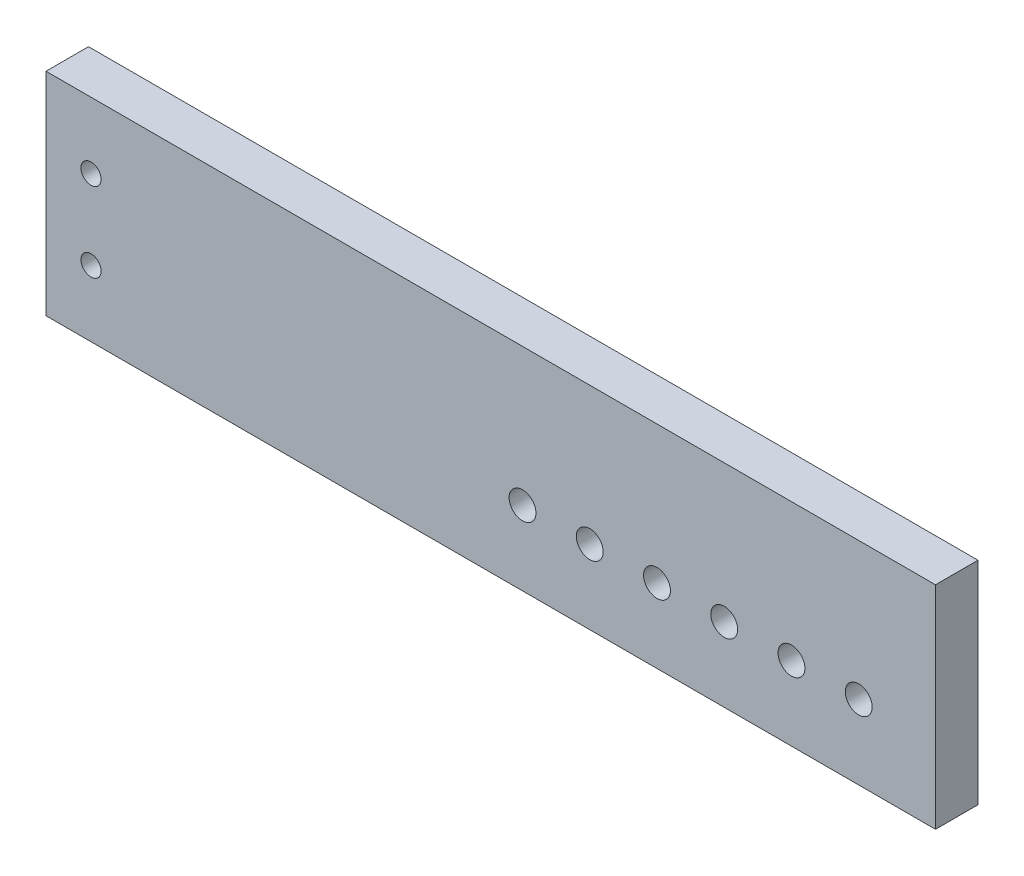
ISO-10303-21;
HEADER;
FILE_DESCRIPTION(('STEP AP214'),'2;1');
FILE_NAME('part.step','',(''),(''),'','','');
FILE_SCHEMA(('AUTOMOTIVE_DESIGN { 1 0 10303 214 1 1 1 1 }'));
ENDSEC;
DATA;
#1=APPLICATION_CONTEXT('core data for automotive mechanical design processes');
#2=APPLICATION_PROTOCOL_DEFINITION('international standard','automotive_design',2000,#1);
#3=PRODUCT_CONTEXT('',#1,'mechanical');
#4=PRODUCT('Part','Part','',(#3));
#5=PRODUCT_RELATED_PRODUCT_CATEGORY('part','',(#4));
#6=PRODUCT_DEFINITION_FORMATION('','',#4);
#7=PRODUCT_DEFINITION_CONTEXT('part definition',#1,'design');
#8=PRODUCT_DEFINITION('design','',#6,#7);
#9=PRODUCT_DEFINITION_SHAPE('','',#8);
#10=(LENGTH_UNIT() NAMED_UNIT(*) SI_UNIT(.MILLI.,.METRE.));
#11=(NAMED_UNIT(*) PLANE_ANGLE_UNIT() SI_UNIT($,.RADIAN.));
#12=(NAMED_UNIT(*) SI_UNIT($,.STERADIAN.) SOLID_ANGLE_UNIT());
#13=UNCERTAINTY_MEASURE_WITH_UNIT(LENGTH_MEASURE(1.E-05),#10,'distance_accuracy_value','');
#14=(GEOMETRIC_REPRESENTATION_CONTEXT(3) GLOBAL_UNCERTAINTY_ASSIGNED_CONTEXT((#13)) GLOBAL_UNIT_ASSIGNED_CONTEXT((#10,
#11,#12)) REPRESENTATION_CONTEXT('',''));
#15=CARTESIAN_POINT('',(0.,0.,0.));
#16=DIRECTION('',(0.,0.,1.));
#17=DIRECTION('',(1.,0.,0.));
#18=AXIS2_PLACEMENT_3D('',#15,#16,#17);
#19=CARTESIAN_POINT('',(37.5,5.4,0.803));
#20=DIRECTION('',(0.,0.,-1.));
#21=DIRECTION('',(-1.,0.,0.));
#22=AXIS2_PLACEMENT_3D('',#19,#20,#21);
#23=PLANE('',#22);
#24=CARTESIAN_POINT('',(34.6,0.2,0.803));
#25=DIRECTION('',(0.,0.,-1.));
#26=DIRECTION('',(-1.,0.,0.));
#27=AXIS2_PLACEMENT_3D('',#24,#25,#26);
#28=CIRCLE('',#27,0.508);
#29=CARTESIAN_POINT('',(34.092,0.2,0.803));
#30=VERTEX_POINT('',#29);
#31=EDGE_CURVE('E103',#30,#30,#28,.T.);
#32=ORIENTED_EDGE('',*,*,#31,.T.);
#33=EDGE_LOOP('',(#32));
#34=FACE_BOUND('',#33,.T.);
#35=CARTESIAN_POINT('',(29.52,0.2,0.803));
#36=DIRECTION('',(0.,0.,-1.));
#37=DIRECTION('',(-1.,0.,0.));
#38=AXIS2_PLACEMENT_3D('',#35,#36,#37);
#39=CIRCLE('',#38,0.508);
#40=CARTESIAN_POINT('',(29.012,0.2,0.803));
#41=VERTEX_POINT('',#40);
#42=EDGE_CURVE('E107',#41,#41,#39,.T.);
#43=ORIENTED_EDGE('',*,*,#42,.T.);
#44=EDGE_LOOP('',(#43));
#45=FACE_BOUND('',#44,.T.);
#46=CARTESIAN_POINT('',(32.06,0.2,0.803));
#47=DIRECTION('',(0.,0.,-1.));
#48=DIRECTION('',(-1.,0.,0.));
#49=AXIS2_PLACEMENT_3D('',#46,#47,#48);
#50=CIRCLE('',#49,0.508);
#51=CARTESIAN_POINT('',(31.552,0.2,0.803));
#52=VERTEX_POINT('',#51);
#53=EDGE_CURVE('E110',#52,#52,#50,.T.);
#54=ORIENTED_EDGE('',*,*,#53,.T.);
#55=EDGE_LOOP('',(#54));
#56=FACE_BOUND('',#55,.T.);
#57=CARTESIAN_POINT('',(5.6,-0.1,0.803));
#58=DIRECTION('',(0.,0.,-1.));
#59=DIRECTION('',(-1.,0.,0.));
#60=AXIS2_PLACEMENT_3D('',#57,#58,#59);
#61=CIRCLE('',#60,0.381);
#62=CARTESIAN_POINT('',(5.219,-0.1,0.803));
#63=VERTEX_POINT('',#62);
#64=EDGE_CURVE('E113',#63,#63,#61,.T.);
#65=ORIENTED_EDGE('',*,*,#64,.T.);
#66=EDGE_LOOP('',(#65));
#67=FACE_BOUND('',#66,.T.);
#68=CARTESIAN_POINT('',(5.6,2.9,0.803));
#69=DIRECTION('',(0.,0.,-1.));
#70=DIRECTION('',(-1.,0.,0.));
#71=AXIS2_PLACEMENT_3D('',#68,#69,#70);
#72=CIRCLE('',#71,0.381);
#73=CARTESIAN_POINT('',(5.219,2.9,0.803));
#74=VERTEX_POINT('',#73);
#75=EDGE_CURVE('E116',#74,#74,#72,.T.);
#76=ORIENTED_EDGE('',*,*,#75,.T.);
#77=EDGE_LOOP('',(#76));
#78=FACE_BOUND('',#77,.T.);
#79=CARTESIAN_POINT('',(24.44,0.2,0.803));
#80=DIRECTION('',(0.,0.,-1.));
#81=DIRECTION('',(-1.,0.,0.));
#82=AXIS2_PLACEMENT_3D('',#79,#80,#81);
#83=CIRCLE('',#82,0.508);
#84=CARTESIAN_POINT('',(23.932,0.2,0.803));
#85=VERTEX_POINT('',#84);
#86=EDGE_CURVE('E119',#85,#85,#83,.T.);
#87=ORIENTED_EDGE('',*,*,#86,.T.);
#88=EDGE_LOOP('',(#87));
#89=FACE_BOUND('',#88,.T.);
#90=CARTESIAN_POINT('',(21.9,0.2,0.803));
#91=DIRECTION('',(0.,0.,-1.));
#92=DIRECTION('',(-1.,0.,0.));
#93=AXIS2_PLACEMENT_3D('',#90,#91,#92);
#94=CIRCLE('',#93,0.508);
#95=CARTESIAN_POINT('',(21.392,0.2,0.803));
#96=VERTEX_POINT('',#95);
#97=EDGE_CURVE('E121',#96,#96,#94,.T.);
#98=ORIENTED_EDGE('',*,*,#97,.T.);
#99=EDGE_LOOP('',(#98));
#100=FACE_BOUND('',#99,.T.);
#101=CARTESIAN_POINT('',(26.98,0.2,0.803));
#102=DIRECTION('',(0.,0.,-1.));
#103=DIRECTION('',(-1.,0.,0.));
#104=AXIS2_PLACEMENT_3D('',#101,#102,#103);
#105=CIRCLE('',#104,0.508);
#106=CARTESIAN_POINT('',(26.472,0.2,0.803));
#107=VERTEX_POINT('',#106);
#108=EDGE_CURVE('E20',#107,#107,#105,.T.);
#109=ORIENTED_EDGE('',*,*,#108,.T.);
#110=EDGE_LOOP('',(#109));
#111=FACE_BOUND('',#110,.T.);
#112=DIRECTION('',(1.,0.,0.));
#113=VECTOR('',#112,1.);
#114=CARTESIAN_POINT('',(3.9,-2.6,0.803));
#115=LINE('',#114,#113);
#116=CARTESIAN_POINT('',(3.9,-2.6,0.803));
#117=VERTEX_POINT('',#116);
#118=CARTESIAN_POINT('',(37.5,-2.6,0.803));
#119=VERTEX_POINT('',#118);
#120=EDGE_CURVE('E55',#117,#119,#115,.T.);
#121=ORIENTED_EDGE('',*,*,#120,.T.);
#122=DIRECTION('',(0.,1.,0.));
#123=VECTOR('',#122,1.);
#124=CARTESIAN_POINT('',(37.5,-2.6,0.803));
#125=LINE('',#124,#123);
#126=CARTESIAN_POINT('',(37.5,5.4,0.803));
#127=VERTEX_POINT('',#126);
#128=EDGE_CURVE('E57',#119,#127,#125,.T.);
#129=ORIENTED_EDGE('',*,*,#128,.T.);
#130=DIRECTION('',(1.,0.,0.));
#131=VECTOR('',#130,1.);
#132=CARTESIAN_POINT('',(37.5,5.4,0.803));
#133=LINE('',#132,#131);
#134=CARTESIAN_POINT('',(3.9,5.4,0.803));
#135=VERTEX_POINT('',#134);
#136=EDGE_CURVE('E59',#127,#135,#133,.F.);
#137=ORIENTED_EDGE('',*,*,#136,.T.);
#138=DIRECTION('',(0.,1.,0.));
#139=VECTOR('',#138,1.);
#140=CARTESIAN_POINT('',(3.9,5.4,0.803));
#141=LINE('',#140,#139);
#142=EDGE_CURVE('E128',#135,#117,#141,.F.);
#143=ORIENTED_EDGE('',*,*,#142,.T.);
#144=EDGE_LOOP('',(#121,#129,#137,#143));
#145=FACE_BOUND('',#144,.T.);
#146=ADVANCED_FACE('F17',(#34,#45,#56,#67,#78,#89,#100,#111,#145),#23,.F.);
#147=CARTESIAN_POINT('',(37.5,5.4,-0.803));
#148=DIRECTION('',(0.,-1.,0.));
#149=DIRECTION('',(0.,0.,-1.));
#150=AXIS2_PLACEMENT_3D('',#147,#148,#149);
#151=PLANE('',#150);
#152=DIRECTION('',(0.,0.,-1.));
#153=VECTOR('',#152,1.);
#154=CARTESIAN_POINT('',(3.9,5.4,-0.803));
#155=LINE('',#154,#153);
#156=CARTESIAN_POINT('',(3.9,5.4,-0.803));
#157=VERTEX_POINT('',#156);
#158=EDGE_CURVE('E70',#157,#135,#155,.F.);
#159=ORIENTED_EDGE('',*,*,#158,.T.);
#160=ORIENTED_EDGE('',*,*,#136,.F.);
#161=DIRECTION('',(0.,0.,1.));
#162=VECTOR('',#161,1.);
#163=CARTESIAN_POINT('',(37.5,5.4,-0.803));
#164=LINE('',#163,#162);
#165=CARTESIAN_POINT('',(37.5,5.4,-0.803));
#166=VERTEX_POINT('',#165);
#167=EDGE_CURVE('E64',#127,#166,#164,.F.);
#168=ORIENTED_EDGE('',*,*,#167,.T.);
#169=DIRECTION('',(-1.,0.,0.));
#170=VECTOR('',#169,1.);
#171=CARTESIAN_POINT('',(37.5,5.4,-0.803));
#172=LINE('',#171,#170);
#173=EDGE_CURVE('E106',#157,#166,#172,.F.);
#174=ORIENTED_EDGE('',*,*,#173,.F.);
#175=EDGE_LOOP('',(#159,#160,#168,#174));
#176=FACE_BOUND('',#175,.T.);
#177=ADVANCED_FACE('F67',(#176),#151,.F.);
#178=CARTESIAN_POINT('',(37.5,-2.6,-0.803));
#179=DIRECTION('',(-1.,0.,0.));
#180=DIRECTION('',(0.,0.,1.));
#181=AXIS2_PLACEMENT_3D('',#178,#179,#180);
#182=PLANE('',#181);
#183=ORIENTED_EDGE('',*,*,#167,.F.);
#184=ORIENTED_EDGE('',*,*,#128,.F.);
#185=DIRECTION('',(0.,0.,1.));
#186=VECTOR('',#185,1.);
#187=CARTESIAN_POINT('',(37.5,-2.6,-0.803));
#188=LINE('',#187,#186);
#189=CARTESIAN_POINT('',(37.5,-2.6,-0.803));
#190=VERTEX_POINT('',#189);
#191=EDGE_CURVE('E78',#119,#190,#188,.F.);
#192=ORIENTED_EDGE('',*,*,#191,.T.);
#193=DIRECTION('',(0.,1.,0.));
#194=VECTOR('',#193,1.);
#195=CARTESIAN_POINT('',(37.5,5.4,-0.803));
#196=LINE('',#195,#194);
#197=EDGE_CURVE('E75',#166,#190,#196,.F.);
#198=ORIENTED_EDGE('',*,*,#197,.F.);
#199=EDGE_LOOP('',(#183,#184,#192,#198));
#200=FACE_BOUND('',#199,.T.);
#201=ADVANCED_FACE('F73',(#200),#182,.F.);
#202=CARTESIAN_POINT('',(3.9,-2.6,-0.803));
#203=DIRECTION('',(0.,1.,0.));
#204=DIRECTION('',(0.,0.,1.));
#205=AXIS2_PLACEMENT_3D('',#202,#203,#204);
#206=PLANE('',#205);
#207=ORIENTED_EDGE('',*,*,#191,.F.);
#208=ORIENTED_EDGE('',*,*,#120,.F.);
#209=DIRECTION('',(0.,0.,-1.));
#210=VECTOR('',#209,1.);
#211=CARTESIAN_POINT('',(3.9,-2.6,-0.803));
#212=LINE('',#211,#210);
#213=CARTESIAN_POINT('',(3.9,-2.6,-0.803));
#214=VERTEX_POINT('',#213);
#215=EDGE_CURVE('E35',#117,#214,#212,.T.);
#216=ORIENTED_EDGE('',*,*,#215,.T.);
#217=DIRECTION('',(-1.,0.,0.));
#218=VECTOR('',#217,1.);
#219=CARTESIAN_POINT('',(37.5,-2.6,-0.803));
#220=LINE('',#219,#218);
#221=EDGE_CURVE('E135',#190,#214,#220,.T.);
#222=ORIENTED_EDGE('',*,*,#221,.F.);
#223=EDGE_LOOP('',(#207,#208,#216,#222));
#224=FACE_BOUND('',#223,.T.);
#225=ADVANCED_FACE('F136',(#224),#206,.F.);
#226=CARTESIAN_POINT('',(3.9,5.4,-0.803));
#227=DIRECTION('',(1.,0.,0.));
#228=DIRECTION('',(0.,0.,-1.));
#229=AXIS2_PLACEMENT_3D('',#226,#227,#228);
#230=PLANE('',#229);
#231=ORIENTED_EDGE('',*,*,#215,.F.);
#232=ORIENTED_EDGE('',*,*,#142,.F.);
#233=ORIENTED_EDGE('',*,*,#158,.F.);
#234=DIRECTION('',(0.,1.,0.));
#235=VECTOR('',#234,1.);
#236=CARTESIAN_POINT('',(3.9,5.4,-0.803));
#237=LINE('',#236,#235);
#238=EDGE_CURVE('E102',#214,#157,#237,.T.);
#239=ORIENTED_EDGE('',*,*,#238,.F.);
#240=EDGE_LOOP('',(#231,#232,#233,#239));
#241=FACE_BOUND('',#240,.T.);
#242=ADVANCED_FACE('F143',(#241),#230,.F.);
#243=CARTESIAN_POINT('',(26.98,0.2,-0.803));
#244=DIRECTION('',(0.,0.,-1.));
#245=DIRECTION('',(-1.,0.,0.));
#246=AXIS2_PLACEMENT_3D('',#243,#244,#245);
#247=CYLINDRICAL_SURFACE('',#246,0.508);
#248=ORIENTED_EDGE('',*,*,#108,.F.);
#249=EDGE_LOOP('',(#248));
#250=FACE_BOUND('',#249,.T.);
#251=CARTESIAN_POINT('',(26.98,0.2,-0.803));
#252=DIRECTION('',(0.,0.,-1.));
#253=DIRECTION('',(-1.,0.,0.));
#254=AXIS2_PLACEMENT_3D('',#251,#252,#253);
#255=CIRCLE('',#254,0.508);
#256=CARTESIAN_POINT('',(26.472,0.2,-0.803));
#257=VERTEX_POINT('',#256);
#258=EDGE_CURVE('E99',#257,#257,#255,.F.);
#259=ORIENTED_EDGE('',*,*,#258,.F.);
#260=EDGE_LOOP('',(#259));
#261=FACE_BOUND('',#260,.T.);
#262=ADVANCED_FACE('F145',(#250,#261),#247,.F.);
#263=CARTESIAN_POINT('',(21.9,0.2,-0.803));
#264=DIRECTION('',(0.,0.,-1.));
#265=DIRECTION('',(-1.,0.,0.));
#266=AXIS2_PLACEMENT_3D('',#263,#264,#265);
#267=CYLINDRICAL_SURFACE('',#266,0.508);
#268=ORIENTED_EDGE('',*,*,#97,.F.);
#269=EDGE_LOOP('',(#268));
#270=FACE_BOUND('',#269,.T.);
#271=CARTESIAN_POINT('',(21.9,0.2,-0.803));
#272=DIRECTION('',(0.,0.,-1.));
#273=DIRECTION('',(-1.,0.,0.));
#274=AXIS2_PLACEMENT_3D('',#271,#272,#273);
#275=CIRCLE('',#274,0.508);
#276=CARTESIAN_POINT('',(21.392,0.2,-0.803));
#277=VERTEX_POINT('',#276);
#278=EDGE_CURVE('E96',#277,#277,#275,.F.);
#279=ORIENTED_EDGE('',*,*,#278,.F.);
#280=EDGE_LOOP('',(#279));
#281=FACE_BOUND('',#280,.T.);
#282=ADVANCED_FACE('F152',(#270,#281),#267,.F.);
#283=CARTESIAN_POINT('',(24.44,0.2,-0.803));
#284=DIRECTION('',(0.,0.,-1.));
#285=DIRECTION('',(-1.,0.,0.));
#286=AXIS2_PLACEMENT_3D('',#283,#284,#285);
#287=CYLINDRICAL_SURFACE('',#286,0.508);
#288=ORIENTED_EDGE('',*,*,#86,.F.);
#289=EDGE_LOOP('',(#288));
#290=FACE_BOUND('',#289,.T.);
#291=CARTESIAN_POINT('',(24.44,0.2,-0.803));
#292=DIRECTION('',(0.,0.,-1.));
#293=DIRECTION('',(-1.,0.,0.));
#294=AXIS2_PLACEMENT_3D('',#291,#292,#293);
#295=CIRCLE('',#294,0.508);
#296=CARTESIAN_POINT('',(23.932,0.2,-0.803));
#297=VERTEX_POINT('',#296);
#298=EDGE_CURVE('E93',#297,#297,#295,.F.);
#299=ORIENTED_EDGE('',*,*,#298,.F.);
#300=EDGE_LOOP('',(#299));
#301=FACE_BOUND('',#300,.T.);
#302=ADVANCED_FACE('F182',(#290,#301),#287,.F.);
#303=CARTESIAN_POINT('',(5.6,2.9,-0.803));
#304=DIRECTION('',(0.,0.,-1.));
#305=DIRECTION('',(-1.,0.,0.));
#306=AXIS2_PLACEMENT_3D('',#303,#304,#305);
#307=CYLINDRICAL_SURFACE('',#306,0.381);
#308=ORIENTED_EDGE('',*,*,#75,.F.);
#309=EDGE_LOOP('',(#308));
#310=FACE_BOUND('',#309,.T.);
#311=CARTESIAN_POINT('',(5.6,2.9,-0.803));
#312=DIRECTION('',(0.,0.,-1.));
#313=DIRECTION('',(-1.,0.,0.));
#314=AXIS2_PLACEMENT_3D('',#311,#312,#313);
#315=CIRCLE('',#314,0.381);
#316=CARTESIAN_POINT('',(5.219,2.9,-0.803));
#317=VERTEX_POINT('',#316);
#318=EDGE_CURVE('E90',#317,#317,#315,.F.);
#319=ORIENTED_EDGE('',*,*,#318,.F.);
#320=EDGE_LOOP('',(#319));
#321=FACE_BOUND('',#320,.T.);
#322=ADVANCED_FACE('F178',(#310,#321),#307,.F.);
#323=CARTESIAN_POINT('',(5.6,-0.1,-0.803));
#324=DIRECTION('',(0.,0.,-1.));
#325=DIRECTION('',(-1.,0.,0.));
#326=AXIS2_PLACEMENT_3D('',#323,#324,#325);
#327=CYLINDRICAL_SURFACE('',#326,0.381);
#328=ORIENTED_EDGE('',*,*,#64,.F.);
#329=EDGE_LOOP('',(#328));
#330=FACE_BOUND('',#329,.T.);
#331=CARTESIAN_POINT('',(5.6,-0.1,-0.803));
#332=DIRECTION('',(0.,0.,-1.));
#333=DIRECTION('',(-1.,0.,0.));
#334=AXIS2_PLACEMENT_3D('',#331,#332,#333);
#335=CIRCLE('',#334,0.381);
#336=CARTESIAN_POINT('',(5.219,-0.1,-0.803));
#337=VERTEX_POINT('',#336);
#338=EDGE_CURVE('E87',#337,#337,#335,.F.);
#339=ORIENTED_EDGE('',*,*,#338,.F.);
#340=EDGE_LOOP('',(#339));
#341=FACE_BOUND('',#340,.T.);
#342=ADVANCED_FACE('F174',(#330,#341),#327,.F.);
#343=CARTESIAN_POINT('',(32.06,0.2,-0.803));
#344=DIRECTION('',(0.,0.,-1.));
#345=DIRECTION('',(-1.,0.,0.));
#346=AXIS2_PLACEMENT_3D('',#343,#344,#345);
#347=CYLINDRICAL_SURFACE('',#346,0.508);
#348=ORIENTED_EDGE('',*,*,#53,.F.);
#349=EDGE_LOOP('',(#348));
#350=FACE_BOUND('',#349,.T.);
#351=CARTESIAN_POINT('',(32.06,0.2,-0.803));
#352=DIRECTION('',(0.,0.,-1.));
#353=DIRECTION('',(-1.,0.,0.));
#354=AXIS2_PLACEMENT_3D('',#351,#352,#353);
#355=CIRCLE('',#354,0.508);
#356=CARTESIAN_POINT('',(31.552,0.2,-0.803));
#357=VERTEX_POINT('',#356);
#358=EDGE_CURVE('E84',#357,#357,#355,.F.);
#359=ORIENTED_EDGE('',*,*,#358,.F.);
#360=EDGE_LOOP('',(#359));
#361=FACE_BOUND('',#360,.T.);
#362=ADVANCED_FACE('F170',(#350,#361),#347,.F.);
#363=CARTESIAN_POINT('',(29.52,0.2,-0.803));
#364=DIRECTION('',(0.,0.,-1.));
#365=DIRECTION('',(-1.,0.,0.));
#366=AXIS2_PLACEMENT_3D('',#363,#364,#365);
#367=CYLINDRICAL_SURFACE('',#366,0.508);
#368=ORIENTED_EDGE('',*,*,#42,.F.);
#369=EDGE_LOOP('',(#368));
#370=FACE_BOUND('',#369,.T.);
#371=CARTESIAN_POINT('',(29.52,0.2,-0.803));
#372=DIRECTION('',(0.,0.,-1.));
#373=DIRECTION('',(-1.,0.,0.));
#374=AXIS2_PLACEMENT_3D('',#371,#372,#373);
#375=CIRCLE('',#374,0.508);
#376=CARTESIAN_POINT('',(29.012,0.2,-0.803));
#377=VERTEX_POINT('',#376);
#378=EDGE_CURVE('E26',#377,#377,#375,.F.);
#379=ORIENTED_EDGE('',*,*,#378,.F.);
#380=EDGE_LOOP('',(#379));
#381=FACE_BOUND('',#380,.T.);
#382=ADVANCED_FACE('F163',(#370,#381),#367,.F.);
#383=CARTESIAN_POINT('',(34.6,0.2,-0.803));
#384=DIRECTION('',(0.,0.,-1.));
#385=DIRECTION('',(-1.,0.,0.));
#386=AXIS2_PLACEMENT_3D('',#383,#384,#385);
#387=CYLINDRICAL_SURFACE('',#386,0.508);
#388=ORIENTED_EDGE('',*,*,#31,.F.);
#389=EDGE_LOOP('',(#388));
#390=FACE_BOUND('',#389,.T.);
#391=CARTESIAN_POINT('',(34.6,0.2,-0.803));
#392=DIRECTION('',(0.,0.,-1.));
#393=DIRECTION('',(-1.,0.,0.));
#394=AXIS2_PLACEMENT_3D('',#391,#392,#393);
#395=CIRCLE('',#394,0.508);
#396=CARTESIAN_POINT('',(34.092,0.2,-0.803));
#397=VERTEX_POINT('',#396);
#398=EDGE_CURVE('E11',#397,#397,#395,.F.);
#399=ORIENTED_EDGE('',*,*,#398,.F.);
#400=EDGE_LOOP('',(#399));
#401=FACE_BOUND('',#400,.T.);
#402=ADVANCED_FACE('F157',(#390,#401),#387,.F.);
#403=CARTESIAN_POINT('',(37.5,5.4,-0.803));
#404=DIRECTION('',(0.,0.,-1.));
#405=DIRECTION('',(-1.,0.,0.));
#406=AXIS2_PLACEMENT_3D('',#403,#404,#405);
#407=PLANE('',#406);
#408=ORIENTED_EDGE('',*,*,#398,.T.);
#409=EDGE_LOOP('',(#408));
#410=FACE_BOUND('',#409,.T.);
#411=ORIENTED_EDGE('',*,*,#378,.T.);
#412=EDGE_LOOP('',(#411));
#413=FACE_BOUND('',#412,.T.);
#414=ORIENTED_EDGE('',*,*,#358,.T.);
#415=EDGE_LOOP('',(#414));
#416=FACE_BOUND('',#415,.T.);
#417=ORIENTED_EDGE('',*,*,#338,.T.);
#418=EDGE_LOOP('',(#417));
#419=FACE_BOUND('',#418,.T.);
#420=ORIENTED_EDGE('',*,*,#318,.T.);
#421=EDGE_LOOP('',(#420));
#422=FACE_BOUND('',#421,.T.);
#423=ORIENTED_EDGE('',*,*,#298,.T.);
#424=EDGE_LOOP('',(#423));
#425=FACE_BOUND('',#424,.T.);
#426=ORIENTED_EDGE('',*,*,#278,.T.);
#427=EDGE_LOOP('',(#426));
#428=FACE_BOUND('',#427,.T.);
#429=ORIENTED_EDGE('',*,*,#258,.T.);
#430=EDGE_LOOP('',(#429));
#431=FACE_BOUND('',#430,.T.);
#432=ORIENTED_EDGE('',*,*,#221,.T.);
#433=ORIENTED_EDGE('',*,*,#238,.T.);
#434=ORIENTED_EDGE('',*,*,#173,.T.);
#435=ORIENTED_EDGE('',*,*,#197,.T.);
#436=EDGE_LOOP('',(#432,#433,#434,#435));
#437=FACE_BOUND('',#436,.T.);
#438=ADVANCED_FACE('F140',(#410,#413,#416,#419,#422,#425,#428,#431,#437),#407,.T.);
#439=CLOSED_SHELL('',(#146,#177,#201,#225,#242,#262,#282,#302,#322,#342,#362,#382,#402,#438));
#440=MANIFOLD_SOLID_BREP('B1',#439);
#441=ADVANCED_BREP_SHAPE_REPRESENTATION('',(#18,#440),#14);
#442=SHAPE_DEFINITION_REPRESENTATION(#9,#441);
ENDSEC;
END-ISO-10303-21;
